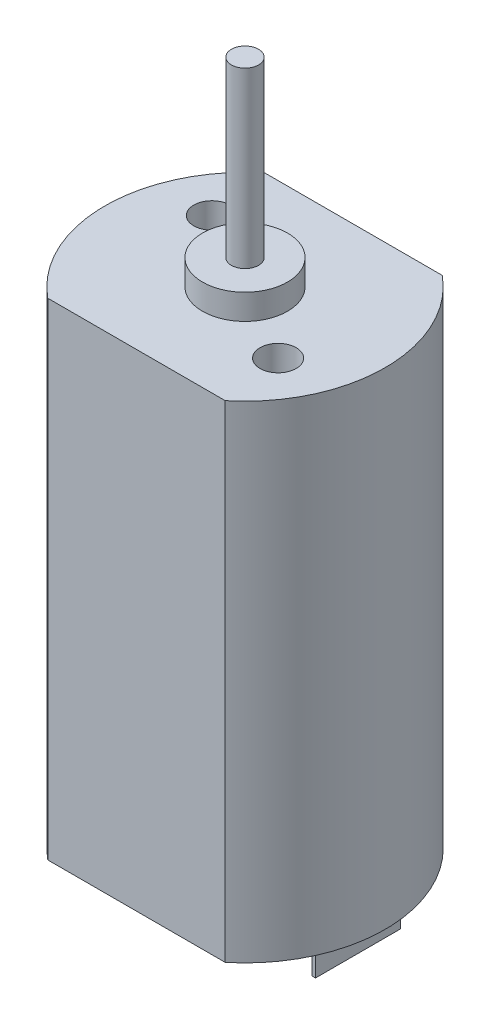
ISO-10303-21;
HEADER;
FILE_DESCRIPTION(('STEP AP214'),'2;1');
FILE_NAME('part.step','',(''),(''),'','','');
FILE_SCHEMA(('AUTOMOTIVE_DESIGN { 1 0 10303 214 1 1 1 1 }'));
ENDSEC;
DATA;
#1=APPLICATION_CONTEXT('core data for automotive mechanical design processes');
#2=APPLICATION_PROTOCOL_DEFINITION('international standard','automotive_design',2000,#1);
#3=PRODUCT_CONTEXT('',#1,'mechanical');
#4=PRODUCT('Part','Part','',(#3));
#5=PRODUCT_RELATED_PRODUCT_CATEGORY('part','',(#4));
#6=PRODUCT_DEFINITION_FORMATION('','',#4);
#7=PRODUCT_DEFINITION_CONTEXT('part definition',#1,'design');
#8=PRODUCT_DEFINITION('design','',#6,#7);
#9=PRODUCT_DEFINITION_SHAPE('','',#8);
#10=(LENGTH_UNIT() NAMED_UNIT(*) SI_UNIT(.MILLI.,.METRE.));
#11=(NAMED_UNIT(*) PLANE_ANGLE_UNIT() SI_UNIT($,.RADIAN.));
#12=(NAMED_UNIT(*) SI_UNIT($,.STERADIAN.) SOLID_ANGLE_UNIT());
#13=UNCERTAINTY_MEASURE_WITH_UNIT(LENGTH_MEASURE(1.E-05),#10,'distance_accuracy_value','');
#14=(GEOMETRIC_REPRESENTATION_CONTEXT(3) GLOBAL_UNCERTAINTY_ASSIGNED_CONTEXT((#13)) GLOBAL_UNIT_ASSIGNED_CONTEXT((#10,
#11,#12)) REPRESENTATION_CONTEXT('',''));
#15=CARTESIAN_POINT('',(0.,0.,0.));
#16=DIRECTION('',(0.,0.,1.));
#17=DIRECTION('',(1.,0.,0.));
#18=AXIS2_PLACEMENT_3D('',#15,#16,#17);
#19=CARTESIAN_POINT('',(0.,-13.45,0.));
#20=DIRECTION('',(0.,1.,0.));
#21=DIRECTION('',(0.,0.,1.));
#22=AXIS2_PLACEMENT_3D('',#19,#20,#21);
#23=PLANE('',#22);
#24=DIRECTION('',(0.,0.,-1.));
#25=VECTOR('',#24,1.);
#26=CARTESIAN_POINT('',(-6.25,-13.45,2.35));
#27=LINE('',#26,#25);
#28=CARTESIAN_POINT('',(-6.25,-13.45,2.35));
#29=VERTEX_POINT('',#28);
#30=CARTESIAN_POINT('',(-6.25,-13.45,-2.35));
#31=VERTEX_POINT('',#30);
#32=EDGE_CURVE('E156',#29,#31,#27,.T.);
#33=ORIENTED_EDGE('',*,*,#32,.F.);
#34=DIRECTION('',(-1.,0.,0.));
#35=VECTOR('',#34,1.);
#36=CARTESIAN_POINT('',(-6.25,-13.45,2.35));
#37=LINE('',#36,#35);
#38=CARTESIAN_POINT('',(-6.05,-13.45,2.35));
#39=VERTEX_POINT('',#38);
#40=EDGE_CURVE('E169',#39,#29,#37,.T.);
#41=ORIENTED_EDGE('',*,*,#40,.F.);
#42=DIRECTION('',(0.,0.,1.));
#43=VECTOR('',#42,1.);
#44=CARTESIAN_POINT('',(-6.05,-13.45,2.35));
#45=LINE('',#44,#43);
#46=CARTESIAN_POINT('',(-6.05,-13.45,-2.35));
#47=VERTEX_POINT('',#46);
#48=EDGE_CURVE('E178',#47,#39,#45,.T.);
#49=ORIENTED_EDGE('',*,*,#48,.F.);
#50=DIRECTION('',(1.,0.,0.));
#51=VECTOR('',#50,1.);
#52=CARTESIAN_POINT('',(-6.25,-13.45,-2.35));
#53=LINE('',#52,#51);
#54=EDGE_CURVE('E159',#31,#47,#53,.T.);
#55=ORIENTED_EDGE('',*,*,#54,.F.);
#56=EDGE_LOOP('',(#33,#41,#49,#55));
#57=FACE_BOUND('',#56,.T.);
#58=CARTESIAN_POINT('',(0.,-13.45,0.));
#59=DIRECTION('',(0.,1.,0.));
#60=DIRECTION('',(0.,0.,1.));
#61=AXIS2_PLACEMENT_3D('',#58,#59,#60);
#62=CIRCLE('',#61,7.75);
#63=CARTESIAN_POINT('',(4.90535421758714,-13.45,6.));
#64=VERTEX_POINT('',#63);
#65=CARTESIAN_POINT('',(4.90535421758714,-13.45,-6.));
#66=VERTEX_POINT('',#65);
#67=EDGE_CURVE('E204',#64,#66,#62,.T.);
#68=ORIENTED_EDGE('',*,*,#67,.F.);
#69=DIRECTION('',(1.,0.,0.));
#70=VECTOR('',#69,1.);
#71=CARTESIAN_POINT('',(4.90535421758714,-13.45,6.));
#72=LINE('',#71,#70);
#73=CARTESIAN_POINT('',(-4.90535421758714,-13.45,6.));
#74=VERTEX_POINT('',#73);
#75=EDGE_CURVE('E211',#74,#64,#72,.T.);
#76=ORIENTED_EDGE('',*,*,#75,.F.);
#77=CARTESIAN_POINT('',(0.,-13.45,0.));
#78=DIRECTION('',(0.,1.,0.));
#79=DIRECTION('',(0.,0.,1.));
#80=AXIS2_PLACEMENT_3D('',#77,#78,#79);
#81=CIRCLE('',#80,7.75);
#82=CARTESIAN_POINT('',(-4.90535421758714,-13.45,-6.));
#83=VERTEX_POINT('',#82);
#84=EDGE_CURVE('E222',#83,#74,#81,.T.);
#85=ORIENTED_EDGE('',*,*,#84,.F.);
#86=DIRECTION('',(-1.,0.,0.));
#87=VECTOR('',#86,1.);
#88=CARTESIAN_POINT('',(-4.90535421758714,-13.45,-6.));
#89=LINE('',#88,#87);
#90=EDGE_CURVE('E220',#66,#83,#89,.T.);
#91=ORIENTED_EDGE('',*,*,#90,.F.);
#92=EDGE_LOOP('',(#68,#76,#85,#91));
#93=FACE_BOUND('',#92,.T.);
#94=DIRECTION('',(0.,0.,-1.));
#95=VECTOR('',#94,1.);
#96=CARTESIAN_POINT('',(6.05,-13.45,2.35));
#97=LINE('',#96,#95);
#98=CARTESIAN_POINT('',(6.05,-13.45,2.35));
#99=VERTEX_POINT('',#98);
#100=CARTESIAN_POINT('',(6.05,-13.45,-2.35));
#101=VERTEX_POINT('',#100);
#102=EDGE_CURVE('E155',#99,#101,#97,.T.);
#103=ORIENTED_EDGE('',*,*,#102,.F.);
#104=DIRECTION('',(-1.,0.,0.));
#105=VECTOR('',#104,1.);
#106=CARTESIAN_POINT('',(6.05,-13.45,2.35));
#107=LINE('',#106,#105);
#108=CARTESIAN_POINT('',(6.25,-13.45,2.35));
#109=VERTEX_POINT('',#108);
#110=EDGE_CURVE('E152',#109,#99,#107,.T.);
#111=ORIENTED_EDGE('',*,*,#110,.F.);
#112=DIRECTION('',(0.,0.,1.));
#113=VECTOR('',#112,1.);
#114=CARTESIAN_POINT('',(6.25,-13.45,2.35));
#115=LINE('',#114,#113);
#116=CARTESIAN_POINT('',(6.25,-13.45,-2.35));
#117=VERTEX_POINT('',#116);
#118=EDGE_CURVE('E66',#117,#109,#115,.T.);
#119=ORIENTED_EDGE('',*,*,#118,.F.);
#120=DIRECTION('',(1.,0.,0.));
#121=VECTOR('',#120,1.);
#122=CARTESIAN_POINT('',(6.05,-13.45,-2.35));
#123=LINE('',#122,#121);
#124=EDGE_CURVE('E61',#101,#117,#123,.T.);
#125=ORIENTED_EDGE('',*,*,#124,.F.);
#126=EDGE_LOOP('',(#103,#111,#119,#125));
#127=FACE_BOUND('',#126,.T.);
#128=ADVANCED_FACE('F46',(#57,#93,#127),#23,.F.);
#129=CARTESIAN_POINT('',(0.,13.45,0.));
#130=DIRECTION('',(0.,-1.,0.));
#131=DIRECTION('',(0.,0.,-1.));
#132=AXIS2_PLACEMENT_3D('',#129,#130,#131);
#133=CYLINDRICAL_SURFACE('',#132,7.75);
#134=ORIENTED_EDGE('',*,*,#67,.T.);
#135=DIRECTION('',(0.,-1.,0.));
#136=VECTOR('',#135,1.);
#137=CARTESIAN_POINT('',(4.90535421758714,13.45,-6.));
#138=LINE('',#137,#136);
#139=CARTESIAN_POINT('',(4.90535421758714,13.45,-6.));
#140=VERTEX_POINT('',#139);
#141=EDGE_CURVE('E13',#140,#66,#138,.T.);
#142=ORIENTED_EDGE('',*,*,#141,.F.);
#143=CARTESIAN_POINT('',(0.,13.45,0.));
#144=DIRECTION('',(0.,1.,0.));
#145=DIRECTION('',(0.,0.,1.));
#146=AXIS2_PLACEMENT_3D('',#143,#144,#145);
#147=CIRCLE('',#146,7.75);
#148=CARTESIAN_POINT('',(4.90535421758714,13.45,6.));
#149=VERTEX_POINT('',#148);
#150=EDGE_CURVE('E207',#149,#140,#147,.T.);
#151=ORIENTED_EDGE('',*,*,#150,.F.);
#152=DIRECTION('',(0.,-1.,0.));
#153=VECTOR('',#152,1.);
#154=CARTESIAN_POINT('',(4.90535421758714,13.45,6.));
#155=LINE('',#154,#153);
#156=EDGE_CURVE('E217',#149,#64,#155,.T.);
#157=ORIENTED_EDGE('',*,*,#156,.T.);
#158=EDGE_LOOP('',(#134,#142,#151,#157));
#159=FACE_BOUND('',#158,.T.);
#160=ADVANCED_FACE('F48',(#159),#133,.T.);
#161=CARTESIAN_POINT('',(-4.90535421758714,13.45,-6.));
#162=DIRECTION('',(0.,0.,1.));
#163=DIRECTION('',(1.,0.,0.));
#164=AXIS2_PLACEMENT_3D('',#161,#162,#163);
#165=PLANE('',#164);
#166=ORIENTED_EDGE('',*,*,#90,.T.);
#167=DIRECTION('',(0.,-1.,0.));
#168=VECTOR('',#167,1.);
#169=CARTESIAN_POINT('',(-4.90535421758714,13.45,-6.));
#170=LINE('',#169,#168);
#171=CARTESIAN_POINT('',(-4.90535421758714,13.45,-6.));
#172=VERTEX_POINT('',#171);
#173=EDGE_CURVE('E54',#172,#83,#170,.T.);
#174=ORIENTED_EDGE('',*,*,#173,.F.);
#175=DIRECTION('',(-1.,0.,0.));
#176=VECTOR('',#175,1.);
#177=CARTESIAN_POINT('',(-4.90535421758714,13.45,-6.));
#178=LINE('',#177,#176);
#179=EDGE_CURVE('E210',#140,#172,#178,.T.);
#180=ORIENTED_EDGE('',*,*,#179,.F.);
#181=ORIENTED_EDGE('',*,*,#141,.T.);
#182=EDGE_LOOP('',(#166,#174,#180,#181));
#183=FACE_BOUND('',#182,.T.);
#184=ADVANCED_FACE('F249',(#183),#165,.F.);
#185=CARTESIAN_POINT('',(0.,13.45,0.));
#186=DIRECTION('',(0.,-1.,0.));
#187=DIRECTION('',(0.,0.,-1.));
#188=AXIS2_PLACEMENT_3D('',#185,#186,#187);
#189=CYLINDRICAL_SURFACE('',#188,7.75);
#190=ORIENTED_EDGE('',*,*,#84,.T.);
#191=DIRECTION('',(0.,-1.,0.));
#192=VECTOR('',#191,1.);
#193=CARTESIAN_POINT('',(-4.90535421758714,13.45,6.));
#194=LINE('',#193,#192);
#195=CARTESIAN_POINT('',(-4.90535421758714,13.45,6.));
#196=VERTEX_POINT('',#195);
#197=EDGE_CURVE('E227',#196,#74,#194,.T.);
#198=ORIENTED_EDGE('',*,*,#197,.F.);
#199=CARTESIAN_POINT('',(0.,13.45,0.));
#200=DIRECTION('',(0.,1.,0.));
#201=DIRECTION('',(0.,0.,1.));
#202=AXIS2_PLACEMENT_3D('',#199,#200,#201);
#203=CIRCLE('',#202,7.75);
#204=EDGE_CURVE('E213',#172,#196,#203,.T.);
#205=ORIENTED_EDGE('',*,*,#204,.F.);
#206=ORIENTED_EDGE('',*,*,#173,.T.);
#207=EDGE_LOOP('',(#190,#198,#205,#206));
#208=FACE_BOUND('',#207,.T.);
#209=ADVANCED_FACE('F234',(#208),#189,.T.);
#210=CARTESIAN_POINT('',(4.90535421758714,13.45,6.));
#211=DIRECTION('',(0.,0.,-1.));
#212=DIRECTION('',(-1.,0.,0.));
#213=AXIS2_PLACEMENT_3D('',#210,#211,#212);
#214=PLANE('',#213);
#215=ORIENTED_EDGE('',*,*,#75,.T.);
#216=ORIENTED_EDGE('',*,*,#156,.F.);
#217=DIRECTION('',(1.,0.,0.));
#218=VECTOR('',#217,1.);
#219=CARTESIAN_POINT('',(4.90535421758714,13.45,6.));
#220=LINE('',#219,#218);
#221=EDGE_CURVE('E215',#196,#149,#220,.T.);
#222=ORIENTED_EDGE('',*,*,#221,.F.);
#223=ORIENTED_EDGE('',*,*,#197,.T.);
#224=EDGE_LOOP('',(#215,#216,#222,#223));
#225=FACE_BOUND('',#224,.T.);
#226=ADVANCED_FACE('F242',(#225),#214,.F.);
#227=CARTESIAN_POINT('',(0.,13.45,0.));
#228=DIRECTION('',(0.,1.,0.));
#229=DIRECTION('',(0.,0.,1.));
#230=AXIS2_PLACEMENT_3D('',#227,#228,#229);
#231=PLANE('',#230);
#232=CARTESIAN_POINT('',(4.33012701892221,13.45,2.49999999999997));
#233=DIRECTION('',(0.,1.,0.));
#234=DIRECTION('',(0.,0.,1.));
#235=AXIS2_PLACEMENT_3D('',#232,#233,#234);
#236=CIRCLE('',#235,1.);
#237=CARTESIAN_POINT('',(4.33012701892221,13.45,3.49999999999997));
#238=VERTEX_POINT('',#237);
#239=EDGE_CURVE('E278',#238,#238,#236,.T.);
#240=ORIENTED_EDGE('',*,*,#239,.F.);
#241=EDGE_LOOP('',(#240));
#242=FACE_BOUND('',#241,.T.);
#243=CARTESIAN_POINT('',(-4.33012701892221,13.45,-2.49999999999997));
#244=DIRECTION('',(0.,1.,0.));
#245=DIRECTION('',(0.,0.,1.));
#246=AXIS2_PLACEMENT_3D('',#243,#244,#245);
#247=CIRCLE('',#246,1.);
#248=CARTESIAN_POINT('',(-4.33012701892221,13.45,-1.49999999999997));
#249=VERTEX_POINT('',#248);
#250=EDGE_CURVE('E282',#249,#249,#247,.T.);
#251=ORIENTED_EDGE('',*,*,#250,.F.);
#252=EDGE_LOOP('',(#251));
#253=FACE_BOUND('',#252,.T.);
#254=CARTESIAN_POINT('',(0.,13.45,0.));
#255=DIRECTION('',(0.,1.,0.));
#256=DIRECTION('',(0.,0.,1.));
#257=AXIS2_PLACEMENT_3D('',#254,#255,#256);
#258=CIRCLE('',#257,2.35);
#259=CARTESIAN_POINT('',(0.,13.45,2.35));
#260=VERTEX_POINT('',#259);
#261=EDGE_CURVE('E198',#260,#260,#258,.T.);
#262=ORIENTED_EDGE('',*,*,#261,.F.);
#263=EDGE_LOOP('',(#262));
#264=FACE_BOUND('',#263,.T.);
#265=ORIENTED_EDGE('',*,*,#150,.T.);
#266=ORIENTED_EDGE('',*,*,#179,.T.);
#267=ORIENTED_EDGE('',*,*,#204,.T.);
#268=ORIENTED_EDGE('',*,*,#221,.T.);
#269=EDGE_LOOP('',(#265,#266,#267,#268));
#270=FACE_BOUND('',#269,.T.);
#271=ADVANCED_FACE('F248',(#242,#253,#264,#270),#231,.T.);
#272=CARTESIAN_POINT('',(0.,14.85,0.));
#273=DIRECTION('',(0.,-1.,0.));
#274=DIRECTION('',(0.,0.,-1.));
#275=AXIS2_PLACEMENT_3D('',#272,#273,#274);
#276=CYLINDRICAL_SURFACE('',#275,2.35);
#277=CARTESIAN_POINT('',(0.,14.85,0.));
#278=DIRECTION('',(0.,1.,0.));
#279=DIRECTION('',(0.,0.,1.));
#280=AXIS2_PLACEMENT_3D('',#277,#278,#279);
#281=CIRCLE('',#280,2.35);
#282=CARTESIAN_POINT('',(0.,14.85,2.35));
#283=VERTEX_POINT('',#282);
#284=EDGE_CURVE('E201',#283,#283,#281,.T.);
#285=ORIENTED_EDGE('',*,*,#284,.F.);
#286=EDGE_LOOP('',(#285));
#287=FACE_BOUND('',#286,.T.);
#288=ORIENTED_EDGE('',*,*,#261,.T.);
#289=EDGE_LOOP('',(#288));
#290=FACE_BOUND('',#289,.T.);
#291=ADVANCED_FACE('F268',(#287,#290),#276,.T.);
#292=CARTESIAN_POINT('',(0.,14.85,0.));
#293=DIRECTION('',(0.,1.,0.));
#294=DIRECTION('',(0.,0.,1.));
#295=AXIS2_PLACEMENT_3D('',#292,#293,#294);
#296=PLANE('',#295);
#297=CARTESIAN_POINT('',(0.,14.85,0.));
#298=DIRECTION('',(0.,1.,0.));
#299=DIRECTION('',(0.,0.,1.));
#300=AXIS2_PLACEMENT_3D('',#297,#298,#299);
#301=CIRCLE('',#300,0.75);
#302=CARTESIAN_POINT('',(0.,14.85,0.75));
#303=VERTEX_POINT('',#302);
#304=EDGE_CURVE('E194',#303,#303,#301,.T.);
#305=ORIENTED_EDGE('',*,*,#304,.F.);
#306=EDGE_LOOP('',(#305));
#307=FACE_BOUND('',#306,.T.);
#308=ORIENTED_EDGE('',*,*,#284,.T.);
#309=EDGE_LOOP('',(#308));
#310=FACE_BOUND('',#309,.T.);
#311=ADVANCED_FACE('F273',(#307,#310),#296,.T.);
#312=CARTESIAN_POINT('',(0.,24.45,0.));
#313=DIRECTION('',(0.,-1.,0.));
#314=DIRECTION('',(0.,0.,-1.));
#315=AXIS2_PLACEMENT_3D('',#312,#313,#314);
#316=CYLINDRICAL_SURFACE('',#315,0.75);
#317=CARTESIAN_POINT('',(0.,24.45,0.));
#318=DIRECTION('',(0.,1.,0.));
#319=DIRECTION('',(0.,0.,1.));
#320=AXIS2_PLACEMENT_3D('',#317,#318,#319);
#321=CIRCLE('',#320,0.75);
#322=CARTESIAN_POINT('',(0.,24.45,0.75));
#323=VERTEX_POINT('',#322);
#324=EDGE_CURVE('E195',#323,#323,#321,.T.);
#325=ORIENTED_EDGE('',*,*,#324,.F.);
#326=EDGE_LOOP('',(#325));
#327=FACE_BOUND('',#326,.T.);
#328=ORIENTED_EDGE('',*,*,#304,.T.);
#329=EDGE_LOOP('',(#328));
#330=FACE_BOUND('',#329,.T.);
#331=ADVANCED_FACE('F344',(#327,#330),#316,.T.);
#332=CARTESIAN_POINT('',(0.,24.45,0.));
#333=DIRECTION('',(0.,1.,0.));
#334=DIRECTION('',(0.,0.,1.));
#335=AXIS2_PLACEMENT_3D('',#332,#333,#334);
#336=PLANE('',#335);
#337=ORIENTED_EDGE('',*,*,#324,.T.);
#338=EDGE_LOOP('',(#337));
#339=FACE_BOUND('',#338,.T.);
#340=ADVANCED_FACE('F340',(#339),#336,.T.);
#341=CARTESIAN_POINT('',(-6.25,-15.35,2.35));
#342=DIRECTION('',(1.,0.,0.));
#343=DIRECTION('',(0.,0.,-1.));
#344=AXIS2_PLACEMENT_3D('',#341,#342,#343);
#345=PLANE('',#344);
#346=ORIENTED_EDGE('',*,*,#32,.T.);
#347=DIRECTION('',(0.,1.,0.));
#348=VECTOR('',#347,1.);
#349=CARTESIAN_POINT('',(-6.25,-15.35,-2.35));
#350=LINE('',#349,#348);
#351=CARTESIAN_POINT('',(-6.25,-15.35,-2.35));
#352=VERTEX_POINT('',#351);
#353=EDGE_CURVE('E191',#352,#31,#350,.T.);
#354=ORIENTED_EDGE('',*,*,#353,.F.);
#355=DIRECTION('',(0.,0.,-1.));
#356=VECTOR('',#355,1.);
#357=CARTESIAN_POINT('',(-6.25,-15.35,2.35));
#358=LINE('',#357,#356);
#359=CARTESIAN_POINT('',(-6.25,-15.35,2.35));
#360=VERTEX_POINT('',#359);
#361=EDGE_CURVE('E165',#360,#352,#358,.T.);
#362=ORIENTED_EDGE('',*,*,#361,.F.);
#363=DIRECTION('',(0.,1.,0.));
#364=VECTOR('',#363,1.);
#365=CARTESIAN_POINT('',(-6.25,-15.35,2.35));
#366=LINE('',#365,#364);
#367=EDGE_CURVE('E174',#360,#29,#366,.T.);
#368=ORIENTED_EDGE('',*,*,#367,.T.);
#369=EDGE_LOOP('',(#346,#354,#362,#368));
#370=FACE_BOUND('',#369,.T.);
#371=ADVANCED_FACE('F336',(#370),#345,.F.);
#372=CARTESIAN_POINT('',(-6.25,-15.35,-2.35));
#373=DIRECTION('',(0.,0.,1.));
#374=DIRECTION('',(1.,0.,0.));
#375=AXIS2_PLACEMENT_3D('',#372,#373,#374);
#376=PLANE('',#375);
#377=ORIENTED_EDGE('',*,*,#54,.T.);
#378=DIRECTION('',(0.,1.,0.));
#379=VECTOR('',#378,1.);
#380=CARTESIAN_POINT('',(-6.05,-15.35,-2.35));
#381=LINE('',#380,#379);
#382=CARTESIAN_POINT('',(-6.05,-15.35,-2.35));
#383=VERTEX_POINT('',#382);
#384=EDGE_CURVE('E188',#383,#47,#381,.T.);
#385=ORIENTED_EDGE('',*,*,#384,.F.);
#386=DIRECTION('',(1.,0.,0.));
#387=VECTOR('',#386,1.);
#388=CARTESIAN_POINT('',(-6.25,-15.35,-2.35));
#389=LINE('',#388,#387);
#390=EDGE_CURVE('E168',#352,#383,#389,.T.);
#391=ORIENTED_EDGE('',*,*,#390,.F.);
#392=ORIENTED_EDGE('',*,*,#353,.T.);
#393=EDGE_LOOP('',(#377,#385,#391,#392));
#394=FACE_BOUND('',#393,.T.);
#395=ADVANCED_FACE('F332',(#394),#376,.F.);
#396=CARTESIAN_POINT('',(-6.05,-15.35,2.35));
#397=DIRECTION('',(-1.,0.,0.));
#398=DIRECTION('',(0.,0.,1.));
#399=AXIS2_PLACEMENT_3D('',#396,#397,#398);
#400=PLANE('',#399);
#401=ORIENTED_EDGE('',*,*,#48,.T.);
#402=DIRECTION('',(0.,1.,0.));
#403=VECTOR('',#402,1.);
#404=CARTESIAN_POINT('',(-6.05,-15.35,2.35));
#405=LINE('',#404,#403);
#406=CARTESIAN_POINT('',(-6.05,-15.35,2.35));
#407=VERTEX_POINT('',#406);
#408=EDGE_CURVE('E185',#407,#39,#405,.T.);
#409=ORIENTED_EDGE('',*,*,#408,.F.);
#410=DIRECTION('',(0.,0.,1.));
#411=VECTOR('',#410,1.);
#412=CARTESIAN_POINT('',(-6.05,-15.35,2.35));
#413=LINE('',#412,#411);
#414=EDGE_CURVE('E171',#383,#407,#413,.T.);
#415=ORIENTED_EDGE('',*,*,#414,.F.);
#416=ORIENTED_EDGE('',*,*,#384,.T.);
#417=EDGE_LOOP('',(#401,#409,#415,#416));
#418=FACE_BOUND('',#417,.T.);
#419=ADVANCED_FACE('F328',(#418),#400,.F.);
#420=CARTESIAN_POINT('',(-6.25,-15.35,2.35));
#421=DIRECTION('',(0.,0.,-1.));
#422=DIRECTION('',(-1.,0.,0.));
#423=AXIS2_PLACEMENT_3D('',#420,#421,#422);
#424=PLANE('',#423);
#425=ORIENTED_EDGE('',*,*,#40,.T.);
#426=ORIENTED_EDGE('',*,*,#367,.F.);
#427=DIRECTION('',(-1.,0.,0.));
#428=VECTOR('',#427,1.);
#429=CARTESIAN_POINT('',(-6.25,-15.35,2.35));
#430=LINE('',#429,#428);
#431=EDGE_CURVE('E173',#407,#360,#430,.T.);
#432=ORIENTED_EDGE('',*,*,#431,.F.);
#433=ORIENTED_EDGE('',*,*,#408,.T.);
#434=EDGE_LOOP('',(#425,#426,#432,#433));
#435=FACE_BOUND('',#434,.T.);
#436=ADVANCED_FACE('F324',(#435),#424,.F.);
#437=CARTESIAN_POINT('',(0.,-15.35,0.));
#438=DIRECTION('',(0.,-1.,0.));
#439=DIRECTION('',(0.,0.,-1.));
#440=AXIS2_PLACEMENT_3D('',#437,#438,#439);
#441=PLANE('',#440);
#442=ORIENTED_EDGE('',*,*,#361,.T.);
#443=ORIENTED_EDGE('',*,*,#390,.T.);
#444=ORIENTED_EDGE('',*,*,#414,.T.);
#445=ORIENTED_EDGE('',*,*,#431,.T.);
#446=EDGE_LOOP('',(#442,#443,#444,#445));
#447=FACE_BOUND('',#446,.T.);
#448=ADVANCED_FACE('F321',(#447),#441,.T.);
#449=CARTESIAN_POINT('',(6.05,-15.35,2.35));
#450=DIRECTION('',(1.,0.,0.));
#451=DIRECTION('',(0.,0.,-1.));
#452=AXIS2_PLACEMENT_3D('',#449,#450,#451);
#453=PLANE('',#452);
#454=ORIENTED_EDGE('',*,*,#102,.T.);
#455=DIRECTION('',(0.,1.,0.));
#456=VECTOR('',#455,1.);
#457=CARTESIAN_POINT('',(6.05,-15.35,-2.35));
#458=LINE('',#457,#456);
#459=CARTESIAN_POINT('',(6.05,-15.35,-2.35));
#460=VERTEX_POINT('',#459);
#461=EDGE_CURVE('E136',#460,#101,#458,.T.);
#462=ORIENTED_EDGE('',*,*,#461,.F.);
#463=DIRECTION('',(0.,0.,-1.));
#464=VECTOR('',#463,1.);
#465=CARTESIAN_POINT('',(6.05,-15.35,2.35));
#466=LINE('',#465,#464);
#467=CARTESIAN_POINT('',(6.05,-15.35,2.35));
#468=VERTEX_POINT('',#467);
#469=EDGE_CURVE('E143',#468,#460,#466,.T.);
#470=ORIENTED_EDGE('',*,*,#469,.F.);
#471=DIRECTION('',(0.,1.,0.));
#472=VECTOR('',#471,1.);
#473=CARTESIAN_POINT('',(6.05,-15.35,2.35));
#474=LINE('',#473,#472);
#475=EDGE_CURVE('E297',#468,#99,#474,.T.);
#476=ORIENTED_EDGE('',*,*,#475,.T.);
#477=EDGE_LOOP('',(#454,#462,#470,#476));
#478=FACE_BOUND('',#477,.T.);
#479=ADVANCED_FACE('F154',(#478),#453,.F.);
#480=CARTESIAN_POINT('',(6.05,-15.35,-2.35));
#481=DIRECTION('',(0.,0.,1.));
#482=DIRECTION('',(1.,0.,0.));
#483=AXIS2_PLACEMENT_3D('',#480,#481,#482);
#484=PLANE('',#483);
#485=ORIENTED_EDGE('',*,*,#124,.T.);
#486=DIRECTION('',(0.,1.,0.));
#487=VECTOR('',#486,1.);
#488=CARTESIAN_POINT('',(6.25,-15.35,-2.35));
#489=LINE('',#488,#487);
#490=CARTESIAN_POINT('',(6.25,-15.35,-2.35));
#491=VERTEX_POINT('',#490);
#492=EDGE_CURVE('E139',#491,#117,#489,.T.);
#493=ORIENTED_EDGE('',*,*,#492,.F.);
#494=DIRECTION('',(1.,0.,0.));
#495=VECTOR('',#494,1.);
#496=CARTESIAN_POINT('',(6.05,-15.35,-2.35));
#497=LINE('',#496,#495);
#498=EDGE_CURVE('E132',#460,#491,#497,.T.);
#499=ORIENTED_EDGE('',*,*,#498,.F.);
#500=ORIENTED_EDGE('',*,*,#461,.T.);
#501=EDGE_LOOP('',(#485,#493,#499,#500));
#502=FACE_BOUND('',#501,.T.);
#503=ADVANCED_FACE('F134',(#502),#484,.F.);
#504=CARTESIAN_POINT('',(6.25,-15.35,2.35));
#505=DIRECTION('',(-1.,0.,0.));
#506=DIRECTION('',(0.,0.,1.));
#507=AXIS2_PLACEMENT_3D('',#504,#505,#506);
#508=PLANE('',#507);
#509=ORIENTED_EDGE('',*,*,#118,.T.);
#510=DIRECTION('',(0.,1.,0.));
#511=VECTOR('',#510,1.);
#512=CARTESIAN_POINT('',(6.25,-15.35,2.35));
#513=LINE('',#512,#511);
#514=CARTESIAN_POINT('',(6.25,-15.35,2.35));
#515=VERTEX_POINT('',#514);
#516=EDGE_CURVE('E161',#515,#109,#513,.T.);
#517=ORIENTED_EDGE('',*,*,#516,.F.);
#518=DIRECTION('',(0.,0.,1.));
#519=VECTOR('',#518,1.);
#520=CARTESIAN_POINT('',(6.25,-15.35,2.35));
#521=LINE('',#520,#519);
#522=EDGE_CURVE('E142',#491,#515,#521,.T.);
#523=ORIENTED_EDGE('',*,*,#522,.F.);
#524=ORIENTED_EDGE('',*,*,#492,.T.);
#525=EDGE_LOOP('',(#509,#517,#523,#524));
#526=FACE_BOUND('',#525,.T.);
#527=ADVANCED_FACE('F308',(#526),#508,.F.);
#528=CARTESIAN_POINT('',(6.05,-15.35,2.35));
#529=DIRECTION('',(0.,0.,-1.));
#530=DIRECTION('',(-1.,0.,0.));
#531=AXIS2_PLACEMENT_3D('',#528,#529,#530);
#532=PLANE('',#531);
#533=ORIENTED_EDGE('',*,*,#110,.T.);
#534=ORIENTED_EDGE('',*,*,#475,.F.);
#535=DIRECTION('',(-1.,0.,0.));
#536=VECTOR('',#535,1.);
#537=CARTESIAN_POINT('',(6.05,-15.35,2.35));
#538=LINE('',#537,#536);
#539=EDGE_CURVE('E148',#515,#468,#538,.T.);
#540=ORIENTED_EDGE('',*,*,#539,.F.);
#541=ORIENTED_EDGE('',*,*,#516,.T.);
#542=EDGE_LOOP('',(#533,#534,#540,#541));
#543=FACE_BOUND('',#542,.T.);
#544=ADVANCED_FACE('F306',(#543),#532,.F.);
#545=CARTESIAN_POINT('',(0.,-15.35,0.));
#546=DIRECTION('',(0.,-1.,0.));
#547=DIRECTION('',(0.,0.,-1.));
#548=AXIS2_PLACEMENT_3D('',#545,#546,#547);
#549=PLANE('',#548);
#550=ORIENTED_EDGE('',*,*,#469,.T.);
#551=ORIENTED_EDGE('',*,*,#498,.T.);
#552=ORIENTED_EDGE('',*,*,#522,.T.);
#553=ORIENTED_EDGE('',*,*,#539,.T.);
#554=EDGE_LOOP('',(#550,#551,#552,#553));
#555=FACE_BOUND('',#554,.T.);
#556=ADVANCED_FACE('F146',(#555),#549,.T.);
#557=CARTESIAN_POINT('',(-4.33012701892221,11.55,-2.49999999999997));
#558=DIRECTION('',(0.,1.,0.));
#559=DIRECTION('',(0.,0.,1.));
#560=AXIS2_PLACEMENT_3D('',#557,#558,#559);
#561=CYLINDRICAL_SURFACE('',#560,1.);
#562=CARTESIAN_POINT('',(-4.33012701892221,11.55,-2.49999999999997));
#563=DIRECTION('',(0.,1.,0.));
#564=DIRECTION('',(0.,0.,1.));
#565=AXIS2_PLACEMENT_3D('',#562,#563,#564);
#566=CIRCLE('',#565,1.);
#567=CARTESIAN_POINT('',(-4.33012701892221,11.55,-1.49999999999997));
#568=VERTEX_POINT('',#567);
#569=EDGE_CURVE('E286',#568,#568,#566,.T.);
#570=CARTESIAN_POINT('',(-4.33012701892221,11.55,-1.49999999999997));
#571=CARTESIAN_POINT('',(-4.33012701892221,11.5697916666667,-1.49999999999997));
#572=CARTESIAN_POINT('',(-4.33012701892221,11.5895833333333,-1.49999999999997));
#573=CARTESIAN_POINT('',(-4.33012701892221,11.6291666666667,-1.49999999999997));
#574=CARTESIAN_POINT('',(-4.33012701892221,11.6489583333333,-1.49999999999997));
#575=CARTESIAN_POINT('',(-4.33012701892221,11.6885416666667,-1.49999999999997));
#576=CARTESIAN_POINT('',(-4.33012701892221,11.7083333333333,-1.49999999999997));
#577=CARTESIAN_POINT('',(-4.33012701892221,11.7479166666667,-1.49999999999997));
#578=CARTESIAN_POINT('',(-4.33012701892221,11.7677083333333,-1.49999999999997));
#579=CARTESIAN_POINT('',(-4.33012701892221,11.8072916666667,-1.49999999999997));
#580=CARTESIAN_POINT('',(-4.33012701892221,11.8270833333333,-1.49999999999997));
#581=CARTESIAN_POINT('',(-4.33012701892221,11.8666666666667,-1.49999999999997));
#582=CARTESIAN_POINT('',(-4.33012701892221,11.8864583333333,-1.49999999999997));
#583=CARTESIAN_POINT('',(-4.33012701892221,11.9260416666667,-1.49999999999997));
#584=CARTESIAN_POINT('',(-4.33012701892221,11.9458333333333,-1.49999999999997));
#585=CARTESIAN_POINT('',(-4.33012701892221,11.9854166666667,-1.49999999999997));
#586=CARTESIAN_POINT('',(-4.33012701892221,12.0052083333333,-1.49999999999997));
#587=CARTESIAN_POINT('',(-4.33012701892221,12.0447916666667,-1.49999999999997));
#588=CARTESIAN_POINT('',(-4.33012701892221,12.0645833333333,-1.49999999999997));
#589=CARTESIAN_POINT('',(-4.33012701892221,12.1041666666667,-1.49999999999997));
#590=CARTESIAN_POINT('',(-4.33012701892221,12.1239583333333,-1.49999999999997));
#591=CARTESIAN_POINT('',(-4.33012701892221,12.1635416666667,-1.49999999999997));
#592=CARTESIAN_POINT('',(-4.33012701892221,12.1833333333333,-1.49999999999997));
#593=CARTESIAN_POINT('',(-4.33012701892221,12.2229166666667,-1.49999999999997));
#594=CARTESIAN_POINT('',(-4.33012701892221,12.2427083333333,-1.49999999999997));
#595=CARTESIAN_POINT('',(-4.33012701892221,12.2822916666667,-1.49999999999997));
#596=CARTESIAN_POINT('',(-4.33012701892221,12.3020833333333,-1.49999999999997));
#597=CARTESIAN_POINT('',(-4.33012701892221,12.3416666666667,-1.49999999999997));
#598=CARTESIAN_POINT('',(-4.33012701892221,12.3614583333333,-1.49999999999997));
#599=CARTESIAN_POINT('',(-4.33012701892221,12.4010416666667,-1.49999999999997));
#600=CARTESIAN_POINT('',(-4.33012701892221,12.4208333333333,-1.49999999999997));
#601=CARTESIAN_POINT('',(-4.33012701892221,12.4604166666667,-1.49999999999997));
#602=CARTESIAN_POINT('',(-4.33012701892221,12.4802083333333,-1.49999999999997));
#603=CARTESIAN_POINT('',(-4.33012701892221,12.5197916666667,-1.49999999999997));
#604=CARTESIAN_POINT('',(-4.33012701892221,12.5395833333333,-1.49999999999997));
#605=CARTESIAN_POINT('',(-4.33012701892221,12.5791666666667,-1.49999999999997));
#606=CARTESIAN_POINT('',(-4.33012701892221,12.5989583333333,-1.49999999999997));
#607=CARTESIAN_POINT('',(-4.33012701892221,12.6385416666667,-1.49999999999997));
#608=CARTESIAN_POINT('',(-4.33012701892221,12.6583333333333,-1.49999999999997));
#609=CARTESIAN_POINT('',(-4.33012701892221,12.6979166666667,-1.49999999999997));
#610=CARTESIAN_POINT('',(-4.33012701892221,12.7177083333333,-1.49999999999997));
#611=CARTESIAN_POINT('',(-4.33012701892221,12.7572916666667,-1.49999999999997));
#612=CARTESIAN_POINT('',(-4.33012701892221,12.7770833333333,-1.49999999999997));
#613=CARTESIAN_POINT('',(-4.33012701892221,12.8166666666667,-1.49999999999997));
#614=CARTESIAN_POINT('',(-4.33012701892221,12.8364583333333,-1.49999999999997));
#615=CARTESIAN_POINT('',(-4.33012701892221,12.8760416666667,-1.49999999999997));
#616=CARTESIAN_POINT('',(-4.33012701892221,12.8958333333333,-1.49999999999997));
#617=CARTESIAN_POINT('',(-4.33012701892221,12.9354166666667,-1.49999999999997));
#618=CARTESIAN_POINT('',(-4.33012701892221,12.9552083333333,-1.49999999999997));
#619=CARTESIAN_POINT('',(-4.33012701892221,12.9947916666667,-1.49999999999997));
#620=CARTESIAN_POINT('',(-4.33012701892221,13.0145833333333,-1.49999999999997));
#621=CARTESIAN_POINT('',(-4.33012701892221,13.0541666666667,-1.49999999999997));
#622=CARTESIAN_POINT('',(-4.33012701892221,13.0739583333333,-1.49999999999997));
#623=CARTESIAN_POINT('',(-4.33012701892221,13.1135416666667,-1.49999999999997));
#624=CARTESIAN_POINT('',(-4.33012701892221,13.1333333333333,-1.49999999999997));
#625=CARTESIAN_POINT('',(-4.33012701892221,13.1729166666667,-1.49999999999997));
#626=CARTESIAN_POINT('',(-4.33012701892221,13.1927083333333,-1.49999999999997));
#627=CARTESIAN_POINT('',(-4.33012701892221,13.2322916666667,-1.49999999999997));
#628=CARTESIAN_POINT('',(-4.33012701892221,13.2520833333333,-1.49999999999997));
#629=CARTESIAN_POINT('',(-4.33012701892221,13.2916666666667,-1.49999999999997));
#630=CARTESIAN_POINT('',(-4.33012701892221,13.3114583333333,-1.49999999999997));
#631=CARTESIAN_POINT('',(-4.33012701892221,13.3510416666667,-1.49999999999997));
#632=CARTESIAN_POINT('',(-4.33012701892221,13.3708333333333,-1.49999999999997));
#633=CARTESIAN_POINT('',(-4.33012701892221,13.4104166666667,-1.49999999999997));
#634=CARTESIAN_POINT('',(-4.33012701892221,13.4302083333333,-1.49999999999997));
#635=CARTESIAN_POINT('',(-4.33012701892221,13.45,-1.49999999999997));
#636=B_SPLINE_CURVE_WITH_KNOTS('',3,(#570,#571,#572,#573,#574,#575,#576,#577,#578,#579,#580,
#581,#582,#583,#584,#585,#586,#587,#588,#589,#590,#591,#592,#593,#594,#595,#596,#597,#598,#599,
#600,#601,#602,#603,#604,#605,#606,#607,#608,#609,#610,#611,#612,#613,#614,#615,#616,#617,#618,
#619,#620,#621,#622,#623,#624,#625,#626,#627,#628,#629,#630,#631,#632,#633,#634,#635),
.UNSPECIFIED.,.F.,.F.,(4,2,2,2,2,2,2,2,2,2,2,2,2,2,2,2,2,2,2,2,2,2,2,2,2,2,2,2,2,2,2,2,4),(0.,
0.0593749999999987,0.118749999999999,0.178124999999999,0.2375,0.296874999999999,
0.356249999999999,0.415624999999999,0.475,0.534374999999998,0.593749999999999,0.653124999999999,
0.7125,0.771875,0.831249999999999,0.890624999999999,0.95,1.009375,1.06875,1.128125,1.1875,
1.246875,1.30625,1.365625,1.425,1.484375,1.54375,1.603125,1.6625,1.721875,1.78125,1.840625,1.9),.UNSPECIFIED.);
#637=EDGE_CURVE('BSEAM413',#568,#249,#636,.T.);
#638=ORIENTED_EDGE('',*,*,#569,.F.);
#639=ORIENTED_EDGE('',*,*,#250,.T.);
#640=ORIENTED_EDGE('',*,*,#637,.T.);
#641=ORIENTED_EDGE('',*,*,#637,.F.);
#642=EDGE_LOOP('',(#638,#640,#639,#641));
#643=FACE_BOUND('',#642,.T.);
#644=ADVANCED_FACE('F413',(#643),#561,.F.);
#645=CARTESIAN_POINT('',(-4.33012701892221,11.55,-2.49999999999997));
#646=DIRECTION('',(0.,1.,0.));
#647=DIRECTION('',(0.,0.,1.));
#648=AXIS2_PLACEMENT_3D('',#645,#646,#647);
#649=PLANE('',#648);
#650=ORIENTED_EDGE('',*,*,#569,.T.);
#651=EDGE_LOOP('',(#650));
#652=FACE_BOUND('',#651,.T.);
#653=ADVANCED_FACE('F428',(#652),#649,.T.);
#654=CARTESIAN_POINT('',(4.33012701892221,11.55,2.49999999999997));
#655=DIRECTION('',(0.,1.,0.));
#656=DIRECTION('',(0.,0.,1.));
#657=AXIS2_PLACEMENT_3D('',#654,#655,#656);
#658=CYLINDRICAL_SURFACE('',#657,1.);
#659=CARTESIAN_POINT('',(4.33012701892221,11.55,2.49999999999997));
#660=DIRECTION('',(0.,1.,0.));
#661=DIRECTION('',(0.,0.,1.));
#662=AXIS2_PLACEMENT_3D('',#659,#660,#661);
#663=CIRCLE('',#662,1.);
#664=CARTESIAN_POINT('',(4.33012701892221,11.55,3.49999999999997));
#665=VERTEX_POINT('',#664);
#666=EDGE_CURVE('E287',#665,#665,#663,.T.);
#667=CARTESIAN_POINT('',(4.33012701892221,11.55,3.49999999999997));
#668=CARTESIAN_POINT('',(4.33012701892221,11.5697916666667,3.49999999999997));
#669=CARTESIAN_POINT('',(4.33012701892221,11.5895833333333,3.49999999999997));
#670=CARTESIAN_POINT('',(4.33012701892221,11.6291666666667,3.49999999999997));
#671=CARTESIAN_POINT('',(4.33012701892221,11.6489583333333,3.49999999999997));
#672=CARTESIAN_POINT('',(4.33012701892221,11.6885416666667,3.49999999999997));
#673=CARTESIAN_POINT('',(4.33012701892221,11.7083333333333,3.49999999999997));
#674=CARTESIAN_POINT('',(4.33012701892221,11.7479166666667,3.49999999999997));
#675=CARTESIAN_POINT('',(4.33012701892221,11.7677083333333,3.49999999999997));
#676=CARTESIAN_POINT('',(4.33012701892221,11.8072916666667,3.49999999999997));
#677=CARTESIAN_POINT('',(4.33012701892221,11.8270833333333,3.49999999999997));
#678=CARTESIAN_POINT('',(4.33012701892221,11.8666666666667,3.49999999999997));
#679=CARTESIAN_POINT('',(4.33012701892221,11.8864583333333,3.49999999999997));
#680=CARTESIAN_POINT('',(4.33012701892221,11.9260416666667,3.49999999999997));
#681=CARTESIAN_POINT('',(4.33012701892221,11.9458333333333,3.49999999999997));
#682=CARTESIAN_POINT('',(4.33012701892221,11.9854166666667,3.49999999999997));
#683=CARTESIAN_POINT('',(4.33012701892221,12.0052083333333,3.49999999999997));
#684=CARTESIAN_POINT('',(4.33012701892221,12.0447916666667,3.49999999999997));
#685=CARTESIAN_POINT('',(4.33012701892221,12.0645833333333,3.49999999999997));
#686=CARTESIAN_POINT('',(4.33012701892221,12.1041666666667,3.49999999999997));
#687=CARTESIAN_POINT('',(4.33012701892221,12.1239583333333,3.49999999999997));
#688=CARTESIAN_POINT('',(4.33012701892221,12.1635416666667,3.49999999999997));
#689=CARTESIAN_POINT('',(4.33012701892221,12.1833333333333,3.49999999999997));
#690=CARTESIAN_POINT('',(4.33012701892221,12.2229166666667,3.49999999999997));
#691=CARTESIAN_POINT('',(4.33012701892221,12.2427083333333,3.49999999999997));
#692=CARTESIAN_POINT('',(4.33012701892221,12.2822916666667,3.49999999999997));
#693=CARTESIAN_POINT('',(4.33012701892221,12.3020833333333,3.49999999999997));
#694=CARTESIAN_POINT('',(4.33012701892221,12.3416666666667,3.49999999999997));
#695=CARTESIAN_POINT('',(4.33012701892221,12.3614583333333,3.49999999999997));
#696=CARTESIAN_POINT('',(4.33012701892221,12.4010416666667,3.49999999999997));
#697=CARTESIAN_POINT('',(4.33012701892221,12.4208333333333,3.49999999999997));
#698=CARTESIAN_POINT('',(4.33012701892221,12.4604166666667,3.49999999999997));
#699=CARTESIAN_POINT('',(4.33012701892221,12.4802083333333,3.49999999999997));
#700=CARTESIAN_POINT('',(4.33012701892221,12.5197916666667,3.49999999999997));
#701=CARTESIAN_POINT('',(4.33012701892221,12.5395833333333,3.49999999999997));
#702=CARTESIAN_POINT('',(4.33012701892221,12.5791666666667,3.49999999999997));
#703=CARTESIAN_POINT('',(4.33012701892221,12.5989583333333,3.49999999999997));
#704=CARTESIAN_POINT('',(4.33012701892221,12.6385416666667,3.49999999999997));
#705=CARTESIAN_POINT('',(4.33012701892221,12.6583333333333,3.49999999999997));
#706=CARTESIAN_POINT('',(4.33012701892221,12.6979166666667,3.49999999999997));
#707=CARTESIAN_POINT('',(4.33012701892221,12.7177083333333,3.49999999999997));
#708=CARTESIAN_POINT('',(4.33012701892221,12.7572916666667,3.49999999999997));
#709=CARTESIAN_POINT('',(4.33012701892221,12.7770833333333,3.49999999999997));
#710=CARTESIAN_POINT('',(4.33012701892221,12.8166666666667,3.49999999999997));
#711=CARTESIAN_POINT('',(4.33012701892221,12.8364583333333,3.49999999999997));
#712=CARTESIAN_POINT('',(4.33012701892221,12.8760416666667,3.49999999999997));
#713=CARTESIAN_POINT('',(4.33012701892221,12.8958333333333,3.49999999999997));
#714=CARTESIAN_POINT('',(4.33012701892221,12.9354166666667,3.49999999999997));
#715=CARTESIAN_POINT('',(4.33012701892221,12.9552083333333,3.49999999999997));
#716=CARTESIAN_POINT('',(4.33012701892221,12.9947916666667,3.49999999999997));
#717=CARTESIAN_POINT('',(4.33012701892221,13.0145833333333,3.49999999999997));
#718=CARTESIAN_POINT('',(4.33012701892221,13.0541666666667,3.49999999999997));
#719=CARTESIAN_POINT('',(4.33012701892221,13.0739583333333,3.49999999999997));
#720=CARTESIAN_POINT('',(4.33012701892221,13.1135416666667,3.49999999999997));
#721=CARTESIAN_POINT('',(4.33012701892221,13.1333333333333,3.49999999999997));
#722=CARTESIAN_POINT('',(4.33012701892221,13.1729166666667,3.49999999999997));
#723=CARTESIAN_POINT('',(4.33012701892221,13.1927083333333,3.49999999999997));
#724=CARTESIAN_POINT('',(4.33012701892221,13.2322916666667,3.49999999999997));
#725=CARTESIAN_POINT('',(4.33012701892221,13.2520833333333,3.49999999999997));
#726=CARTESIAN_POINT('',(4.33012701892221,13.2916666666667,3.49999999999997));
#727=CARTESIAN_POINT('',(4.33012701892221,13.3114583333333,3.49999999999997));
#728=CARTESIAN_POINT('',(4.33012701892221,13.3510416666667,3.49999999999997));
#729=CARTESIAN_POINT('',(4.33012701892221,13.3708333333333,3.49999999999997));
#730=CARTESIAN_POINT('',(4.33012701892221,13.4104166666667,3.49999999999997));
#731=CARTESIAN_POINT('',(4.33012701892221,13.4302083333333,3.49999999999997));
#732=CARTESIAN_POINT('',(4.33012701892221,13.45,3.49999999999997));
#733=B_SPLINE_CURVE_WITH_KNOTS('',3,(#667,#668,#669,#670,#671,#672,#673,#674,#675,#676,#677,
#678,#679,#680,#681,#682,#683,#684,#685,#686,#687,#688,#689,#690,#691,#692,#693,#694,#695,#696,
#697,#698,#699,#700,#701,#702,#703,#704,#705,#706,#707,#708,#709,#710,#711,#712,#713,#714,#715,
#716,#717,#718,#719,#720,#721,#722,#723,#724,#725,#726,#727,#728,#729,#730,#731,#732),
.UNSPECIFIED.,.F.,.F.,(4,2,2,2,2,2,2,2,2,2,2,2,2,2,2,2,2,2,2,2,2,2,2,2,2,2,2,2,2,2,2,2,4),(0.,
0.0593749999999987,0.118749999999999,0.178124999999999,0.2375,0.296874999999999,
0.356249999999999,0.415624999999999,0.475,0.534374999999998,0.593749999999999,0.653124999999999,
0.7125,0.771875,0.831249999999999,0.890624999999999,0.95,1.009375,1.06875,1.128125,1.1875,
1.246875,1.30625,1.365625,1.425,1.484375,1.54375,1.603125,1.6625,1.721875,1.78125,1.840625,1.9),.UNSPECIFIED.);
#734=EDGE_CURVE('BSEAM438',#665,#238,#733,.T.);
#735=ORIENTED_EDGE('',*,*,#666,.F.);
#736=ORIENTED_EDGE('',*,*,#239,.T.);
#737=ORIENTED_EDGE('',*,*,#734,.T.);
#738=ORIENTED_EDGE('',*,*,#734,.F.);
#739=EDGE_LOOP('',(#735,#737,#736,#738));
#740=FACE_BOUND('',#739,.T.);
#741=ADVANCED_FACE('F438',(#740),#658,.F.);
#742=CARTESIAN_POINT('',(4.33012701892221,11.55,2.49999999999997));
#743=DIRECTION('',(0.,1.,0.));
#744=DIRECTION('',(0.,0.,1.));
#745=AXIS2_PLACEMENT_3D('',#742,#743,#744);
#746=PLANE('',#745);
#747=ORIENTED_EDGE('',*,*,#666,.T.);
#748=EDGE_LOOP('',(#747));
#749=FACE_BOUND('',#748,.T.);
#750=ADVANCED_FACE('F448',(#749),#746,.T.);
#751=CLOSED_SHELL('',(#128,#160,#184,#209,#226,#271,#291,#311,#331,#340,#371,#395,#419,#436,
#448,#479,#503,#527,#544,#556,#644,#653,#741,#750));
#752=MANIFOLD_SOLID_BREP('B2',#751);
#753=ADVANCED_BREP_SHAPE_REPRESENTATION('',(#18,#752),#14);
#754=SHAPE_DEFINITION_REPRESENTATION(#9,#753);
ENDSEC;
END-ISO-10303-21;
